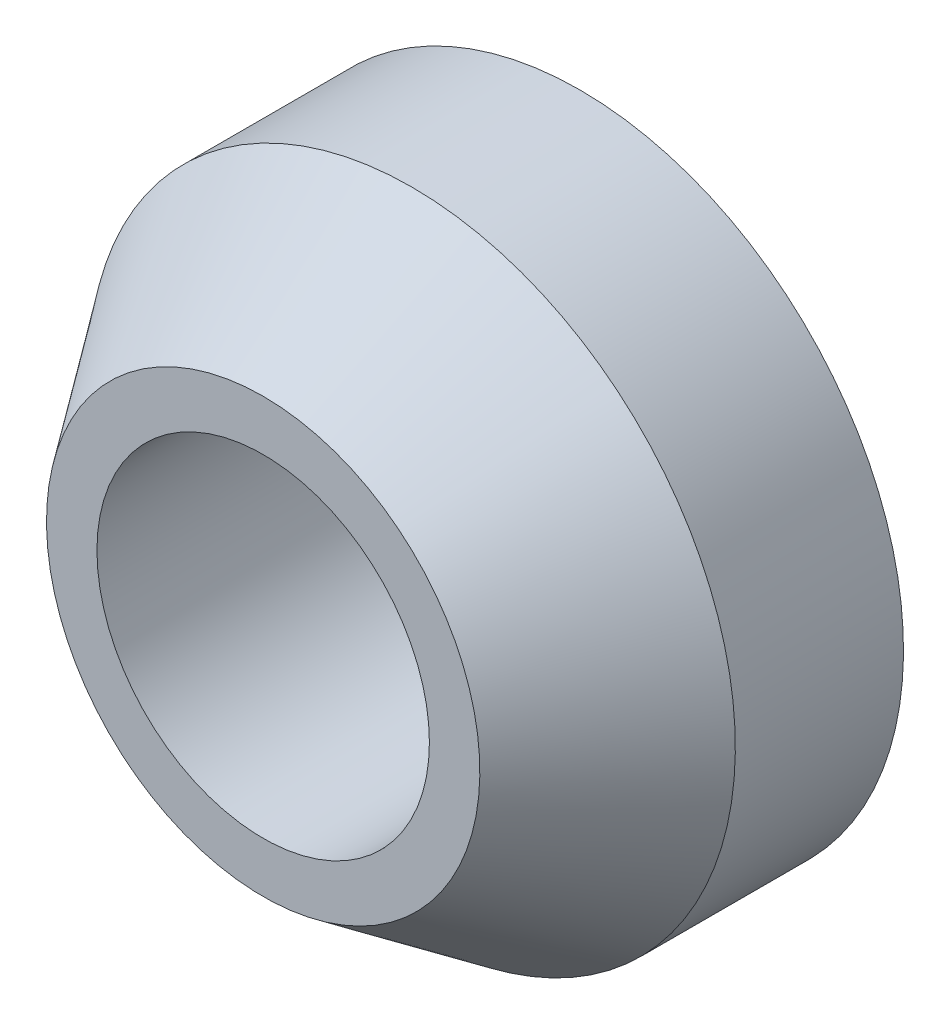
ISO-10303-21;
HEADER;
FILE_DESCRIPTION(('STEP AP214'),'2;1');
FILE_NAME('part.step','',(''),(''),'','','');
FILE_SCHEMA(('AUTOMOTIVE_DESIGN { 1 0 10303 214 1 1 1 1 }'));
ENDSEC;
DATA;
#1=APPLICATION_CONTEXT('core data for automotive mechanical design processes');
#2=APPLICATION_PROTOCOL_DEFINITION('international standard','automotive_design',2000,#1);
#3=PRODUCT_CONTEXT('',#1,'mechanical');
#4=PRODUCT('Part','Part','',(#3));
#5=PRODUCT_RELATED_PRODUCT_CATEGORY('part','',(#4));
#6=PRODUCT_DEFINITION_FORMATION('','',#4);
#7=PRODUCT_DEFINITION_CONTEXT('part definition',#1,'design');
#8=PRODUCT_DEFINITION('design','',#6,#7);
#9=PRODUCT_DEFINITION_SHAPE('','',#8);
#10=(LENGTH_UNIT() NAMED_UNIT(*) SI_UNIT(.MILLI.,.METRE.));
#11=(NAMED_UNIT(*) PLANE_ANGLE_UNIT() SI_UNIT($,.RADIAN.));
#12=(NAMED_UNIT(*) SI_UNIT($,.STERADIAN.) SOLID_ANGLE_UNIT());
#13=UNCERTAINTY_MEASURE_WITH_UNIT(LENGTH_MEASURE(1.E-05),#10,'distance_accuracy_value','');
#14=(GEOMETRIC_REPRESENTATION_CONTEXT(3) GLOBAL_UNCERTAINTY_ASSIGNED_CONTEXT((#13)) GLOBAL_UNIT_ASSIGNED_CONTEXT((#10,
#11,#12)) REPRESENTATION_CONTEXT('',''));
#15=CARTESIAN_POINT('',(0.,0.,0.));
#16=DIRECTION('',(0.,0.,1.));
#17=DIRECTION('',(1.,0.,0.));
#18=AXIS2_PLACEMENT_3D('',#15,#16,#17);
#19=CARTESIAN_POINT('',(0.,0.,0.));
#20=DIRECTION('',(0.,0.,-1.));
#21=DIRECTION('',(0.,1.,0.));
#22=AXIS2_PLACEMENT_3D('',#19,#20,#21);
#23=CYLINDRICAL_SURFACE('',#22,6.35);
#24=CARTESIAN_POINT('',(0.,0.,3.429));
#25=DIRECTION('',(0.,0.,-1.));
#26=DIRECTION('',(0.,1.,0.));
#27=AXIS2_PLACEMENT_3D('',#24,#25,#26);
#28=CIRCLE('',#27,6.35);
#29=CARTESIAN_POINT('',(0.,6.35,3.429));
#30=VERTEX_POINT('',#29);
#31=EDGE_CURVE('E49',#30,#30,#28,.T.);
#32=ORIENTED_EDGE('',*,*,#31,.T.);
#33=EDGE_LOOP('',(#32));
#34=FACE_BOUND('',#33,.T.);
#35=CARTESIAN_POINT('',(0.,0.,0.127));
#36=DIRECTION('',(0.,0.,-1.));
#37=DIRECTION('',(0.,1.,0.));
#38=AXIS2_PLACEMENT_3D('',#35,#36,#37);
#39=CIRCLE('',#38,6.35);
#40=CARTESIAN_POINT('',(0.,6.35,0.127000000000001));
#41=VERTEX_POINT('',#40);
#42=EDGE_CURVE('E58',#41,#41,#39,.F.);
#43=ORIENTED_EDGE('',*,*,#42,.T.);
#44=EDGE_LOOP('',(#43));
#45=FACE_BOUND('',#44,.T.);
#46=ADVANCED_FACE('F41',(#34,#45),#23,.T.);
#47=CARTESIAN_POINT('',(0.,0.,6.35));
#48=DIRECTION('',(0.,0.,1.));
#49=DIRECTION('',(1.,0.,0.));
#50=AXIS2_PLACEMENT_3D('',#47,#48,#49);
#51=CYLINDRICAL_SURFACE('',#50,3.26389999999999);
#52=CARTESIAN_POINT('',(0.,0.,6.35));
#53=DIRECTION('',(0.,0.,1.));
#54=DIRECTION('',(1.,0.,0.));
#55=AXIS2_PLACEMENT_3D('',#52,#53,#54);
#56=CIRCLE('',#55,3.26389999999999);
#57=CARTESIAN_POINT('',(3.26389999999999,0.,6.35));
#58=VERTEX_POINT('',#57);
#59=EDGE_CURVE('E53',#58,#58,#56,.T.);
#60=ORIENTED_EDGE('',*,*,#59,.T.);
#61=EDGE_LOOP('',(#60));
#62=FACE_BOUND('',#61,.T.);
#63=CARTESIAN_POINT('',(0.,0.,0.127));
#64=DIRECTION('',(0.,0.,-1.));
#65=DIRECTION('',(0.,1.,0.));
#66=AXIS2_PLACEMENT_3D('',#63,#64,#65);
#67=CIRCLE('',#66,3.26389999999999);
#68=CARTESIAN_POINT('',(0.,3.26389999999999,0.127000000000001));
#69=VERTEX_POINT('',#68);
#70=EDGE_CURVE('E45',#69,#69,#67,.F.);
#71=ORIENTED_EDGE('',*,*,#70,.F.);
#72=EDGE_LOOP('',(#71));
#73=FACE_BOUND('',#72,.T.);
#74=ADVANCED_FACE('F67',(#62,#73),#51,.F.);
#75=CARTESIAN_POINT('',(0.,0.,6.35));
#76=DIRECTION('',(0.,0.,1.));
#77=DIRECTION('',(0.,-1.,0.));
#78=AXIS2_PLACEMENT_3D('',#75,#76,#77);
#79=PLANE('',#78);
#80=ORIENTED_EDGE('',*,*,#59,.F.);
#81=EDGE_LOOP('',(#80));
#82=FACE_BOUND('',#81,.T.);
#83=CARTESIAN_POINT('',(0.,0.,6.35));
#84=DIRECTION('',(0.,0.,-1.));
#85=DIRECTION('',(0.,1.,0.));
#86=AXIS2_PLACEMENT_3D('',#83,#84,#85);
#87=CIRCLE('',#86,4.2545);
#88=CARTESIAN_POINT('',(0.,4.2545,6.35));
#89=VERTEX_POINT('',#88);
#90=EDGE_CURVE('E10',#89,#89,#87,.T.);
#91=ORIENTED_EDGE('',*,*,#90,.F.);
#92=EDGE_LOOP('',(#91));
#93=FACE_BOUND('',#92,.T.);
#94=ADVANCED_FACE('F43',(#82,#93),#79,.T.);
#95=CARTESIAN_POINT('',(0.,0.,3.429));
#96=DIRECTION('',(0.,0.,-1.));
#97=DIRECTION('',(0.,1.,0.));
#98=AXIS2_PLACEMENT_3D('',#95,#96,#97);
#99=CONICAL_SURFACE('',#98,6.35,0.622302871187207);
#100=ORIENTED_EDGE('',*,*,#90,.T.);
#101=EDGE_LOOP('',(#100));
#102=FACE_BOUND('',#101,.T.);
#103=ORIENTED_EDGE('',*,*,#31,.F.);
#104=EDGE_LOOP('',(#103));
#105=FACE_BOUND('',#104,.T.);
#106=ADVANCED_FACE('F75',(#102,#105),#99,.T.);
#107=CARTESIAN_POINT('',(0.,0.,0.127));
#108=DIRECTION('',(0.,0.,-1.));
#109=DIRECTION('',(0.,1.,0.));
#110=AXIS2_PLACEMENT_3D('',#107,#108,#109);
#111=PLANE('',#110);
#112=ORIENTED_EDGE('',*,*,#42,.F.);
#113=EDGE_LOOP('',(#112));
#114=FACE_BOUND('',#113,.T.);
#115=ORIENTED_EDGE('',*,*,#70,.T.);
#116=EDGE_LOOP('',(#115));
#117=FACE_BOUND('',#116,.T.);
#118=ADVANCED_FACE('F65',(#114,#117),#111,.T.);
#119=CLOSED_SHELL('',(#46,#74,#94,#106,#118));
#120=MANIFOLD_SOLID_BREP('B2',#119);
#121=ADVANCED_BREP_SHAPE_REPRESENTATION('',(#18,#120),#14);
#122=SHAPE_DEFINITION_REPRESENTATION(#9,#121);
ENDSEC;
END-ISO-10303-21;
